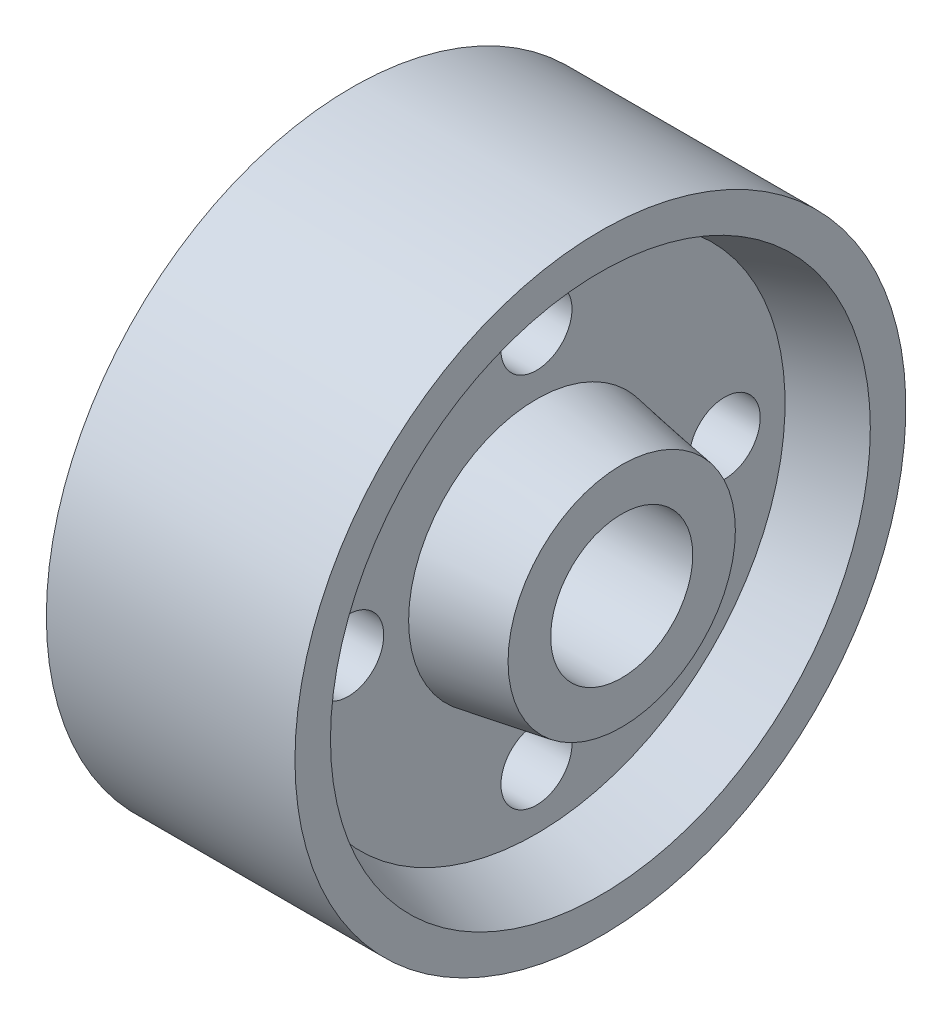
ISO-10303-21;
HEADER;
FILE_DESCRIPTION(('STEP AP214'),'2;1');
FILE_NAME('part.step','',(''),(''),'','','');
FILE_SCHEMA(('AUTOMOTIVE_DESIGN { 1 0 10303 214 1 1 1 1 }'));
ENDSEC;
DATA;
#1=APPLICATION_CONTEXT('core data for automotive mechanical design processes');
#2=APPLICATION_PROTOCOL_DEFINITION('international standard','automotive_design',2000,#1);
#3=PRODUCT_CONTEXT('',#1,'mechanical');
#4=PRODUCT('Part','Part','',(#3));
#5=PRODUCT_RELATED_PRODUCT_CATEGORY('part','',(#4));
#6=PRODUCT_DEFINITION_FORMATION('','',#4);
#7=PRODUCT_DEFINITION_CONTEXT('part definition',#1,'design');
#8=PRODUCT_DEFINITION('design','',#6,#7);
#9=PRODUCT_DEFINITION_SHAPE('','',#8);
#10=(LENGTH_UNIT() NAMED_UNIT(*) SI_UNIT(.MILLI.,.METRE.));
#11=(NAMED_UNIT(*) PLANE_ANGLE_UNIT() SI_UNIT($,.RADIAN.));
#12=(NAMED_UNIT(*) SI_UNIT($,.STERADIAN.) SOLID_ANGLE_UNIT());
#13=UNCERTAINTY_MEASURE_WITH_UNIT(LENGTH_MEASURE(1.E-05),#10,'distance_accuracy_value','');
#14=(GEOMETRIC_REPRESENTATION_CONTEXT(3) GLOBAL_UNCERTAINTY_ASSIGNED_CONTEXT((#13)) GLOBAL_UNIT_ASSIGNED_CONTEXT((#10,
#11,#12)) REPRESENTATION_CONTEXT('',''));
#15=CARTESIAN_POINT('',(0.,0.,0.));
#16=DIRECTION('',(0.,0.,1.));
#17=DIRECTION('',(1.,0.,0.));
#18=AXIS2_PLACEMENT_3D('',#15,#16,#17);
#19=CARTESIAN_POINT('',(41.,0.,0.));
#20=DIRECTION('',(-1.,0.,0.));
#21=DIRECTION('',(0.,0.,1.));
#22=AXIS2_PLACEMENT_3D('',#19,#20,#21);
#23=PLANE('',#22);
#24=CARTESIAN_POINT('',(41.,0.,0.));
#25=DIRECTION('',(1.,0.,0.));
#26=DIRECTION('',(0.,0.,-1.));
#27=AXIS2_PLACEMENT_3D('',#24,#25,#26);
#28=CIRCLE('',#27,10.);
#29=CARTESIAN_POINT('',(41.,0.,-10.));
#30=VERTEX_POINT('',#29);
#31=EDGE_CURVE('E174',#30,#30,#28,.T.);
#32=ORIENTED_EDGE('',*,*,#31,.F.);
#33=EDGE_LOOP('',(#32));
#34=FACE_BOUND('',#33,.T.);
#35=CARTESIAN_POINT('',(41.,0.,0.));
#36=DIRECTION('',(-1.,0.,0.));
#37=DIRECTION('',(0.,0.,1.));
#38=AXIS2_PLACEMENT_3D('',#35,#36,#37);
#39=CIRCLE('',#38,16.);
#40=CARTESIAN_POINT('',(41.,0.,16.));
#41=VERTEX_POINT('',#40);
#42=EDGE_CURVE('E10',#41,#41,#39,.T.);
#43=ORIENTED_EDGE('',*,*,#42,.F.);
#44=EDGE_LOOP('',(#43));
#45=FACE_BOUND('',#44,.T.);
#46=ADVANCED_FACE('F37',(#34,#45),#23,.F.);
#47=CARTESIAN_POINT('',(41.,0.,0.));
#48=DIRECTION('',(-1.,0.,0.));
#49=DIRECTION('',(0.,0.,1.));
#50=AXIS2_PLACEMENT_3D('',#47,#48,#49);
#51=CONICAL_SURFACE('',#50,16.,0.165148677414627);
#52=CARTESIAN_POINT('',(29.,0.,0.));
#53=DIRECTION('',(-1.,0.,0.));
#54=DIRECTION('',(0.,0.,1.));
#55=AXIS2_PLACEMENT_3D('',#52,#53,#54);
#56=CIRCLE('',#55,18.);
#57=CARTESIAN_POINT('',(29.,0.,18.));
#58=VERTEX_POINT('',#57);
#59=EDGE_CURVE('E44',#58,#58,#56,.T.);
#60=ORIENTED_EDGE('',*,*,#59,.F.);
#61=EDGE_LOOP('',(#60));
#62=FACE_BOUND('',#61,.T.);
#63=ORIENTED_EDGE('',*,*,#42,.T.);
#64=EDGE_LOOP('',(#63));
#65=FACE_BOUND('',#64,.T.);
#66=ADVANCED_FACE('F106',(#62,#65),#51,.T.);
#67=CARTESIAN_POINT('',(29.,0.,-18.));
#68=DIRECTION('',(-1.,0.,0.));
#69=DIRECTION('',(0.,0.,1.));
#70=AXIS2_PLACEMENT_3D('',#67,#68,#69);
#71=PLANE('',#70);
#72=CARTESIAN_POINT('',(29.,26.5,0.));
#73=DIRECTION('',(-1.,0.,0.));
#74=DIRECTION('',(0.,0.,1.));
#75=AXIS2_PLACEMENT_3D('',#72,#73,#74);
#76=CIRCLE('',#75,5.);
#77=CARTESIAN_POINT('',(29.,26.5,5.));
#78=VERTEX_POINT('',#77);
#79=EDGE_CURVE('E75',#78,#78,#76,.T.);
#80=ORIENTED_EDGE('',*,*,#79,.T.);
#81=EDGE_LOOP('',(#80));
#82=FACE_BOUND('',#81,.T.);
#83=CARTESIAN_POINT('',(29.,0.,26.5));
#84=DIRECTION('',(-1.,0.,0.));
#85=DIRECTION('',(0.,0.,1.));
#86=AXIS2_PLACEMENT_3D('',#83,#84,#85);
#87=CIRCLE('',#86,5.);
#88=CARTESIAN_POINT('',(29.,0.,31.5));
#89=VERTEX_POINT('',#88);
#90=EDGE_CURVE('E63',#89,#89,#87,.T.);
#91=ORIENTED_EDGE('',*,*,#90,.T.);
#92=EDGE_LOOP('',(#91));
#93=FACE_BOUND('',#92,.T.);
#94=CARTESIAN_POINT('',(29.,-26.5,0.));
#95=DIRECTION('',(-1.,0.,0.));
#96=DIRECTION('',(0.,0.,1.));
#97=AXIS2_PLACEMENT_3D('',#94,#95,#96);
#98=CIRCLE('',#97,5.);
#99=CARTESIAN_POINT('',(29.,-26.5,5.));
#100=VERTEX_POINT('',#99);
#101=EDGE_CURVE('E60',#100,#100,#98,.T.);
#102=ORIENTED_EDGE('',*,*,#101,.T.);
#103=EDGE_LOOP('',(#102));
#104=FACE_BOUND('',#103,.T.);
#105=CARTESIAN_POINT('',(29.,0.,-26.5));
#106=DIRECTION('',(-1.,0.,0.));
#107=DIRECTION('',(0.,0.,1.));
#108=AXIS2_PLACEMENT_3D('',#105,#106,#107);
#109=CIRCLE('',#108,5.00000000000004);
#110=CARTESIAN_POINT('',(29.,0.,-21.5));
#111=VERTEX_POINT('',#110);
#112=EDGE_CURVE('E56',#111,#111,#109,.T.);
#113=ORIENTED_EDGE('',*,*,#112,.T.);
#114=EDGE_LOOP('',(#113));
#115=FACE_BOUND('',#114,.T.);
#116=CARTESIAN_POINT('',(29.,0.,0.));
#117=DIRECTION('',(-1.,0.,0.));
#118=DIRECTION('',(0.,0.,1.));
#119=AXIS2_PLACEMENT_3D('',#116,#117,#118);
#120=CIRCLE('',#119,35.);
#121=CARTESIAN_POINT('',(29.,0.,35.));
#122=VERTEX_POINT('',#121);
#123=EDGE_CURVE('E49',#122,#122,#120,.T.);
#124=ORIENTED_EDGE('',*,*,#123,.F.);
#125=EDGE_LOOP('',(#124));
#126=FACE_BOUND('',#125,.T.);
#127=ORIENTED_EDGE('',*,*,#59,.T.);
#128=EDGE_LOOP('',(#127));
#129=FACE_BOUND('',#128,.T.);
#130=ADVANCED_FACE('F103',(#82,#93,#104,#115,#126,#129),#71,.F.);
#131=CARTESIAN_POINT('',(29.,0.,0.));
#132=DIRECTION('',(1.,0.,0.));
#133=DIRECTION('',(0.,0.,-1.));
#134=AXIS2_PLACEMENT_3D('',#131,#132,#133);
#135=CONICAL_SURFACE('',#134,35.,0.321750554396642);
#136=CARTESIAN_POINT('',(38.,0.,0.));
#137=DIRECTION('',(-1.,0.,0.));
#138=DIRECTION('',(0.,0.,1.));
#139=AXIS2_PLACEMENT_3D('',#136,#137,#138);
#140=CIRCLE('',#139,38.);
#141=CARTESIAN_POINT('',(38.,0.,38.));
#142=VERTEX_POINT('',#141);
#143=EDGE_CURVE('E96',#142,#142,#140,.T.);
#144=ORIENTED_EDGE('',*,*,#143,.F.);
#145=EDGE_LOOP('',(#144));
#146=FACE_BOUND('',#145,.T.);
#147=ORIENTED_EDGE('',*,*,#123,.T.);
#148=EDGE_LOOP('',(#147));
#149=FACE_BOUND('',#148,.T.);
#150=ADVANCED_FACE('F101',(#146,#149),#135,.F.);
#151=CARTESIAN_POINT('',(38.,0.,-38.));
#152=DIRECTION('',(-1.,0.,0.));
#153=DIRECTION('',(0.,0.,1.));
#154=AXIS2_PLACEMENT_3D('',#151,#152,#153);
#155=PLANE('',#154);
#156=CARTESIAN_POINT('',(38.,0.,0.));
#157=DIRECTION('',(-1.,0.,0.));
#158=DIRECTION('',(0.,0.,1.));
#159=AXIS2_PLACEMENT_3D('',#156,#157,#158);
#160=CIRCLE('',#159,43.);
#161=CARTESIAN_POINT('',(38.,0.,43.));
#162=VERTEX_POINT('',#161);
#163=EDGE_CURVE('E93',#162,#162,#160,.T.);
#164=ORIENTED_EDGE('',*,*,#163,.F.);
#165=EDGE_LOOP('',(#164));
#166=FACE_BOUND('',#165,.T.);
#167=ORIENTED_EDGE('',*,*,#143,.T.);
#168=EDGE_LOOP('',(#167));
#169=FACE_BOUND('',#168,.T.);
#170=ADVANCED_FACE('F119',(#166,#169),#155,.F.);
#171=CARTESIAN_POINT('',(0.,0.,0.));
#172=DIRECTION('',(-1.,0.,0.));
#173=DIRECTION('',(0.,0.,1.));
#174=AXIS2_PLACEMENT_3D('',#171,#172,#173);
#175=CYLINDRICAL_SURFACE('',#174,43.);
#176=CARTESIAN_POINT('',(3.,0.,0.));
#177=DIRECTION('',(-1.,0.,0.));
#178=DIRECTION('',(0.,0.,1.));
#179=AXIS2_PLACEMENT_3D('',#176,#177,#178);
#180=CIRCLE('',#179,43.);
#181=CARTESIAN_POINT('',(3.,0.,43.));
#182=VERTEX_POINT('',#181);
#183=EDGE_CURVE('E90',#182,#182,#180,.T.);
#184=ORIENTED_EDGE('',*,*,#183,.F.);
#185=EDGE_LOOP('',(#184));
#186=FACE_BOUND('',#185,.T.);
#187=ORIENTED_EDGE('',*,*,#163,.T.);
#188=EDGE_LOOP('',(#187));
#189=FACE_BOUND('',#188,.T.);
#190=ADVANCED_FACE('F123',(#186,#189),#175,.T.);
#191=CARTESIAN_POINT('',(3.,0.,-38.));
#192=DIRECTION('',(1.,0.,0.));
#193=DIRECTION('',(0.,0.,-1.));
#194=AXIS2_PLACEMENT_3D('',#191,#192,#193);
#195=PLANE('',#194);
#196=CARTESIAN_POINT('',(3.,0.,0.));
#197=DIRECTION('',(-1.,0.,0.));
#198=DIRECTION('',(0.,0.,1.));
#199=AXIS2_PLACEMENT_3D('',#196,#197,#198);
#200=CIRCLE('',#199,38.);
#201=CARTESIAN_POINT('',(3.,0.,38.));
#202=VERTEX_POINT('',#201);
#203=EDGE_CURVE('E87',#202,#202,#200,.T.);
#204=ORIENTED_EDGE('',*,*,#203,.F.);
#205=EDGE_LOOP('',(#204));
#206=FACE_BOUND('',#205,.T.);
#207=ORIENTED_EDGE('',*,*,#183,.T.);
#208=EDGE_LOOP('',(#207));
#209=FACE_BOUND('',#208,.T.);
#210=ADVANCED_FACE('F127',(#206,#209),#195,.F.);
#211=CARTESIAN_POINT('',(3.,0.,0.));
#212=DIRECTION('',(-1.,0.,0.));
#213=DIRECTION('',(0.,0.,1.));
#214=AXIS2_PLACEMENT_3D('',#211,#212,#213);
#215=CONICAL_SURFACE('',#214,38.,0.321750554396642);
#216=CARTESIAN_POINT('',(12.,0.,0.));
#217=DIRECTION('',(-1.,0.,0.));
#218=DIRECTION('',(0.,0.,1.));
#219=AXIS2_PLACEMENT_3D('',#216,#217,#218);
#220=CIRCLE('',#219,35.);
#221=CARTESIAN_POINT('',(12.,0.,35.));
#222=VERTEX_POINT('',#221);
#223=EDGE_CURVE('E84',#222,#222,#220,.T.);
#224=ORIENTED_EDGE('',*,*,#223,.F.);
#225=EDGE_LOOP('',(#224));
#226=FACE_BOUND('',#225,.T.);
#227=ORIENTED_EDGE('',*,*,#203,.T.);
#228=EDGE_LOOP('',(#227));
#229=FACE_BOUND('',#228,.T.);
#230=ADVANCED_FACE('F131',(#226,#229),#215,.F.);
#231=CARTESIAN_POINT('',(12.,0.,-18.));
#232=DIRECTION('',(1.,0.,0.));
#233=DIRECTION('',(0.,0.,-1.));
#234=AXIS2_PLACEMENT_3D('',#231,#232,#233);
#235=PLANE('',#234);
#236=CARTESIAN_POINT('',(12.,26.5,0.));
#237=DIRECTION('',(1.,0.,0.));
#238=DIRECTION('',(0.,0.,-1.));
#239=AXIS2_PLACEMENT_3D('',#236,#237,#238);
#240=CIRCLE('',#239,5.);
#241=CARTESIAN_POINT('',(12.,26.5,-5.));
#242=VERTEX_POINT('',#241);
#243=EDGE_CURVE('E40',#242,#242,#240,.T.);
#244=ORIENTED_EDGE('',*,*,#243,.T.);
#245=EDGE_LOOP('',(#244));
#246=FACE_BOUND('',#245,.T.);
#247=CARTESIAN_POINT('',(12.,0.,26.5));
#248=DIRECTION('',(1.,0.,0.));
#249=DIRECTION('',(0.,0.,-1.));
#250=AXIS2_PLACEMENT_3D('',#247,#248,#249);
#251=CIRCLE('',#250,5.);
#252=CARTESIAN_POINT('',(12.,0.,21.5));
#253=VERTEX_POINT('',#252);
#254=EDGE_CURVE('E61',#253,#253,#251,.T.);
#255=ORIENTED_EDGE('',*,*,#254,.T.);
#256=EDGE_LOOP('',(#255));
#257=FACE_BOUND('',#256,.T.);
#258=CARTESIAN_POINT('',(12.,-26.5,0.));
#259=DIRECTION('',(1.,0.,0.));
#260=DIRECTION('',(0.,0.,-1.));
#261=AXIS2_PLACEMENT_3D('',#258,#259,#260);
#262=CIRCLE('',#261,5.);
#263=CARTESIAN_POINT('',(12.,-26.5,-5.00000000000001));
#264=VERTEX_POINT('',#263);
#265=EDGE_CURVE('E58',#264,#264,#262,.T.);
#266=ORIENTED_EDGE('',*,*,#265,.T.);
#267=EDGE_LOOP('',(#266));
#268=FACE_BOUND('',#267,.T.);
#269=CARTESIAN_POINT('',(12.,0.,-26.5));
#270=DIRECTION('',(1.,0.,0.));
#271=DIRECTION('',(0.,0.,-1.));
#272=AXIS2_PLACEMENT_3D('',#269,#270,#271);
#273=CIRCLE('',#272,5.00000000000004);
#274=CARTESIAN_POINT('',(12.,0.,-31.5));
#275=VERTEX_POINT('',#274);
#276=EDGE_CURVE('E53',#275,#275,#273,.T.);
#277=ORIENTED_EDGE('',*,*,#276,.T.);
#278=EDGE_LOOP('',(#277));
#279=FACE_BOUND('',#278,.T.);
#280=CARTESIAN_POINT('',(12.,0.,0.));
#281=DIRECTION('',(-1.,0.,0.));
#282=DIRECTION('',(0.,0.,1.));
#283=AXIS2_PLACEMENT_3D('',#280,#281,#282);
#284=CIRCLE('',#283,18.);
#285=CARTESIAN_POINT('',(12.,0.,18.));
#286=VERTEX_POINT('',#285);
#287=EDGE_CURVE('E81',#286,#286,#284,.T.);
#288=ORIENTED_EDGE('',*,*,#287,.F.);
#289=EDGE_LOOP('',(#288));
#290=FACE_BOUND('',#289,.T.);
#291=ORIENTED_EDGE('',*,*,#223,.T.);
#292=EDGE_LOOP('',(#291));
#293=FACE_BOUND('',#292,.T.);
#294=ADVANCED_FACE('F135',(#246,#257,#268,#279,#290,#293),#235,.F.);
#295=CARTESIAN_POINT('',(12.,0.,0.));
#296=DIRECTION('',(1.,0.,0.));
#297=DIRECTION('',(0.,0.,-1.));
#298=AXIS2_PLACEMENT_3D('',#295,#296,#297);
#299=CONICAL_SURFACE('',#298,18.,0.165148677414627);
#300=CARTESIAN_POINT('',(0.,0.,0.));
#301=DIRECTION('',(-1.,0.,0.));
#302=DIRECTION('',(0.,0.,1.));
#303=AXIS2_PLACEMENT_3D('',#300,#301,#302);
#304=CIRCLE('',#303,16.);
#305=CARTESIAN_POINT('',(0.,0.,16.));
#306=VERTEX_POINT('',#305);
#307=EDGE_CURVE('E78',#306,#306,#304,.T.);
#308=ORIENTED_EDGE('',*,*,#307,.F.);
#309=EDGE_LOOP('',(#308));
#310=FACE_BOUND('',#309,.T.);
#311=ORIENTED_EDGE('',*,*,#287,.T.);
#312=EDGE_LOOP('',(#311));
#313=FACE_BOUND('',#312,.T.);
#314=ADVANCED_FACE('F139',(#310,#313),#299,.T.);
#315=CARTESIAN_POINT('',(0.,0.,0.));
#316=DIRECTION('',(1.,0.,0.));
#317=DIRECTION('',(0.,0.,-1.));
#318=AXIS2_PLACEMENT_3D('',#315,#316,#317);
#319=PLANE('',#318);
#320=CARTESIAN_POINT('',(0.,0.,0.));
#321=DIRECTION('',(1.,0.,0.));
#322=DIRECTION('',(0.,0.,-1.));
#323=AXIS2_PLACEMENT_3D('',#320,#321,#322);
#324=CIRCLE('',#323,10.);
#325=CARTESIAN_POINT('',(0.,0.,-10.));
#326=VERTEX_POINT('',#325);
#327=EDGE_CURVE('E57',#326,#326,#324,.T.);
#328=ORIENTED_EDGE('',*,*,#327,.T.);
#329=EDGE_LOOP('',(#328));
#330=FACE_BOUND('',#329,.T.);
#331=ORIENTED_EDGE('',*,*,#307,.T.);
#332=EDGE_LOOP('',(#331));
#333=FACE_BOUND('',#332,.T.);
#334=ADVANCED_FACE('F143',(#330,#333),#319,.F.);
#335=CARTESIAN_POINT('',(0.,0.,-26.5));
#336=DIRECTION('',(1.,0.,0.));
#337=DIRECTION('',(0.,0.,-1.));
#338=AXIS2_PLACEMENT_3D('',#335,#336,#337);
#339=CYLINDRICAL_SURFACE('',#338,5.00000000000004);
#340=ORIENTED_EDGE('',*,*,#276,.F.);
#341=EDGE_LOOP('',(#340));
#342=FACE_BOUND('',#341,.T.);
#343=ORIENTED_EDGE('',*,*,#112,.F.);
#344=EDGE_LOOP('',(#343));
#345=FACE_BOUND('',#344,.T.);
#346=ADVANCED_FACE('F147',(#342,#345),#339,.F.);
#347=CARTESIAN_POINT('',(0.,-26.5,0.));
#348=DIRECTION('',(1.,0.,0.));
#349=DIRECTION('',(0.,0.,-1.));
#350=AXIS2_PLACEMENT_3D('',#347,#348,#349);
#351=CYLINDRICAL_SURFACE('',#350,5.);
#352=ORIENTED_EDGE('',*,*,#265,.F.);
#353=EDGE_LOOP('',(#352));
#354=FACE_BOUND('',#353,.T.);
#355=ORIENTED_EDGE('',*,*,#101,.F.);
#356=EDGE_LOOP('',(#355));
#357=FACE_BOUND('',#356,.T.);
#358=ADVANCED_FACE('F151',(#354,#357),#351,.F.);
#359=CARTESIAN_POINT('',(0.,0.,26.5));
#360=DIRECTION('',(1.,0.,0.));
#361=DIRECTION('',(0.,0.,-1.));
#362=AXIS2_PLACEMENT_3D('',#359,#360,#361);
#363=CYLINDRICAL_SURFACE('',#362,5.);
#364=ORIENTED_EDGE('',*,*,#254,.F.);
#365=EDGE_LOOP('',(#364));
#366=FACE_BOUND('',#365,.T.);
#367=ORIENTED_EDGE('',*,*,#90,.F.);
#368=EDGE_LOOP('',(#367));
#369=FACE_BOUND('',#368,.T.);
#370=ADVANCED_FACE('F155',(#366,#369),#363,.F.);
#371=CARTESIAN_POINT('',(0.,26.5,0.));
#372=DIRECTION('',(1.,0.,0.));
#373=DIRECTION('',(0.,0.,-1.));
#374=AXIS2_PLACEMENT_3D('',#371,#372,#373);
#375=CYLINDRICAL_SURFACE('',#374,5.);
#376=ORIENTED_EDGE('',*,*,#243,.F.);
#377=EDGE_LOOP('',(#376));
#378=FACE_BOUND('',#377,.T.);
#379=ORIENTED_EDGE('',*,*,#79,.F.);
#380=EDGE_LOOP('',(#379));
#381=FACE_BOUND('',#380,.T.);
#382=ADVANCED_FACE('F159',(#378,#381),#375,.F.);
#383=CARTESIAN_POINT('',(0.,0.,0.));
#384=DIRECTION('',(1.,0.,0.));
#385=DIRECTION('',(0.,0.,-1.));
#386=AXIS2_PLACEMENT_3D('',#383,#384,#385);
#387=CYLINDRICAL_SURFACE('',#386,10.);
#388=ORIENTED_EDGE('',*,*,#327,.F.);
#389=EDGE_LOOP('',(#388));
#390=FACE_BOUND('',#389,.T.);
#391=ORIENTED_EDGE('',*,*,#31,.T.);
#392=EDGE_LOOP('',(#391));
#393=FACE_BOUND('',#392,.T.);
#394=ADVANCED_FACE('F163',(#390,#393),#387,.F.);
#395=CLOSED_SHELL('',(#46,#66,#130,#150,#170,#190,#210,#230,#294,#314,#334,#346,#358,#370,#382,#394));
#396=MANIFOLD_SOLID_BREP('B2',#395);
#397=ADVANCED_BREP_SHAPE_REPRESENTATION('',(#18,#396),#14);
#398=SHAPE_DEFINITION_REPRESENTATION(#9,#397);
ENDSEC;
END-ISO-10303-21;
